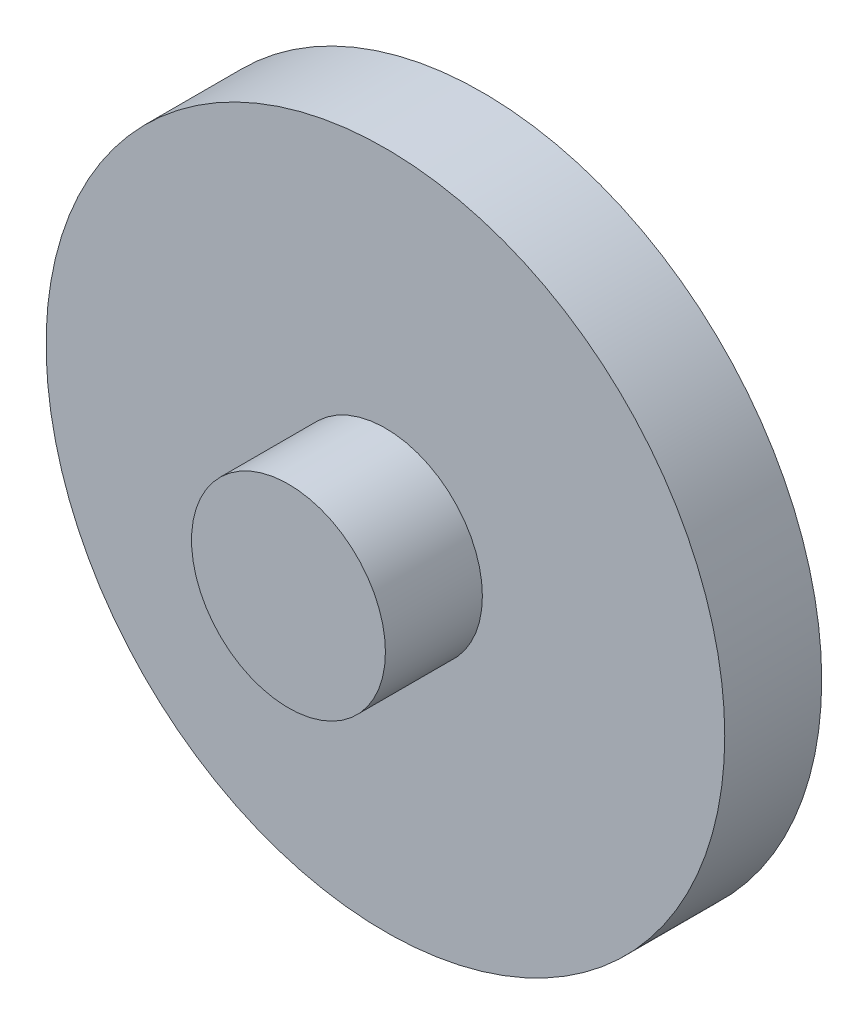
ISO-10303-21;
HEADER;
FILE_DESCRIPTION(('STEP AP214'),'2;1');
FILE_NAME('part.step','',(''),(''),'','','');
FILE_SCHEMA(('AUTOMOTIVE_DESIGN { 1 0 10303 214 1 1 1 1 }'));
ENDSEC;
DATA;
#1=APPLICATION_CONTEXT('core data for automotive mechanical design processes');
#2=APPLICATION_PROTOCOL_DEFINITION('international standard','automotive_design',2000,#1);
#3=PRODUCT_CONTEXT('',#1,'mechanical');
#4=PRODUCT('Part','Part','',(#3));
#5=PRODUCT_RELATED_PRODUCT_CATEGORY('part','',(#4));
#6=PRODUCT_DEFINITION_FORMATION('','',#4);
#7=PRODUCT_DEFINITION_CONTEXT('part definition',#1,'design');
#8=PRODUCT_DEFINITION('design','',#6,#7);
#9=PRODUCT_DEFINITION_SHAPE('','',#8);
#10=(LENGTH_UNIT() NAMED_UNIT(*) SI_UNIT(.MILLI.,.METRE.));
#11=(NAMED_UNIT(*) PLANE_ANGLE_UNIT() SI_UNIT($,.RADIAN.));
#12=(NAMED_UNIT(*) SI_UNIT($,.STERADIAN.) SOLID_ANGLE_UNIT());
#13=UNCERTAINTY_MEASURE_WITH_UNIT(LENGTH_MEASURE(1.E-05),#10,'distance_accuracy_value','');
#14=(GEOMETRIC_REPRESENTATION_CONTEXT(3) GLOBAL_UNCERTAINTY_ASSIGNED_CONTEXT((#13)) GLOBAL_UNIT_ASSIGNED_CONTEXT((#10,
#11,#12)) REPRESENTATION_CONTEXT('',''));
#15=CARTESIAN_POINT('',(0.,0.,0.));
#16=DIRECTION('',(0.,0.,1.));
#17=DIRECTION('',(1.,0.,0.));
#18=AXIS2_PLACEMENT_3D('',#15,#16,#17);
#19=CARTESIAN_POINT('',(0.,0.,5.));
#20=DIRECTION('',(0.,0.,1.));
#21=DIRECTION('',(1.,0.,0.));
#22=AXIS2_PLACEMENT_3D('',#19,#20,#21);
#23=PLANE('',#22);
#24=CARTESIAN_POINT('',(0.,0.,5.));
#25=DIRECTION('',(0.,0.,1.));
#26=DIRECTION('',(1.,0.,0.));
#27=AXIS2_PLACEMENT_3D('',#24,#25,#26);
#28=CIRCLE('',#27,17.5);
#29=CARTESIAN_POINT('',(17.5,0.,5.));
#30=VERTEX_POINT('',#29);
#31=EDGE_CURVE('E10',#30,#30,#28,.T.);
#32=ORIENTED_EDGE('',*,*,#31,.T.);
#33=EDGE_LOOP('',(#32));
#34=FACE_BOUND('',#33,.T.);
#35=CARTESIAN_POINT('',(0.,0.,5.));
#36=DIRECTION('',(0.,0.,1.));
#37=DIRECTION('',(1.,0.,0.));
#38=AXIS2_PLACEMENT_3D('',#35,#36,#37);
#39=CIRCLE('',#38,5.);
#40=CARTESIAN_POINT('',(5.,0.,5.));
#41=VERTEX_POINT('',#40);
#42=EDGE_CURVE('E42',#41,#41,#39,.T.);
#43=ORIENTED_EDGE('',*,*,#42,.F.);
#44=EDGE_LOOP('',(#43));
#45=FACE_BOUND('',#44,.T.);
#46=ADVANCED_FACE('F31',(#34,#45),#23,.T.);
#47=CARTESIAN_POINT('',(0.,0.,0.));
#48=DIRECTION('',(0.,0.,1.));
#49=DIRECTION('',(1.,0.,0.));
#50=AXIS2_PLACEMENT_3D('',#47,#48,#49);
#51=PLANE('',#50);
#52=CARTESIAN_POINT('',(0.,0.,0.));
#53=DIRECTION('',(0.,0.,1.));
#54=DIRECTION('',(1.,0.,0.));
#55=AXIS2_PLACEMENT_3D('',#52,#53,#54);
#56=CIRCLE('',#55,17.5);
#57=CARTESIAN_POINT('',(17.5,0.,0.));
#58=VERTEX_POINT('',#57);
#59=EDGE_CURVE('E35',#58,#58,#56,.T.);
#60=ORIENTED_EDGE('',*,*,#59,.F.);
#61=EDGE_LOOP('',(#60));
#62=FACE_BOUND('',#61,.T.);
#63=ADVANCED_FACE('F61',(#62),#51,.F.);
#64=CARTESIAN_POINT('',(0.,0.,5.));
#65=DIRECTION('',(0.,0.,-1.));
#66=DIRECTION('',(-1.,0.,0.));
#67=AXIS2_PLACEMENT_3D('',#64,#65,#66);
#68=CYLINDRICAL_SURFACE('',#67,17.5);
#69=ORIENTED_EDGE('',*,*,#31,.F.);
#70=EDGE_LOOP('',(#69));
#71=FACE_BOUND('',#70,.T.);
#72=ORIENTED_EDGE('',*,*,#59,.T.);
#73=EDGE_LOOP('',(#72));
#74=FACE_BOUND('',#73,.T.);
#75=ADVANCED_FACE('F33',(#71,#74),#68,.T.);
#76=CARTESIAN_POINT('',(0.,0.,10.));
#77=DIRECTION('',(0.,0.,-1.));
#78=DIRECTION('',(-1.,0.,0.));
#79=AXIS2_PLACEMENT_3D('',#76,#77,#78);
#80=CYLINDRICAL_SURFACE('',#79,5.);
#81=ORIENTED_EDGE('',*,*,#42,.T.);
#82=EDGE_LOOP('',(#81));
#83=FACE_BOUND('',#82,.T.);
#84=CARTESIAN_POINT('',(0.,0.,10.));
#85=DIRECTION('',(0.,0.,1.));
#86=DIRECTION('',(1.,0.,0.));
#87=AXIS2_PLACEMENT_3D('',#84,#85,#86);
#88=CIRCLE('',#87,5.);
#89=CARTESIAN_POINT('',(5.,0.,10.));
#90=VERTEX_POINT('',#89);
#91=EDGE_CURVE('E46',#90,#90,#88,.T.);
#92=ORIENTED_EDGE('',*,*,#91,.F.);
#93=EDGE_LOOP('',(#92));
#94=FACE_BOUND('',#93,.T.);
#95=ADVANCED_FACE('F52',(#83,#94),#80,.T.);
#96=CARTESIAN_POINT('',(0.,0.,10.));
#97=DIRECTION('',(0.,0.,1.));
#98=DIRECTION('',(1.,0.,0.));
#99=AXIS2_PLACEMENT_3D('',#96,#97,#98);
#100=PLANE('',#99);
#101=ORIENTED_EDGE('',*,*,#91,.T.);
#102=EDGE_LOOP('',(#101));
#103=FACE_BOUND('',#102,.T.);
#104=ADVANCED_FACE('F50',(#103),#100,.T.);
#105=CLOSED_SHELL('',(#46,#63,#75,#95,#104));
#106=MANIFOLD_SOLID_BREP('B2',#105);
#107=ADVANCED_BREP_SHAPE_REPRESENTATION('',(#18,#106),#14);
#108=SHAPE_DEFINITION_REPRESENTATION(#9,#107);
ENDSEC;
END-ISO-10303-21;
